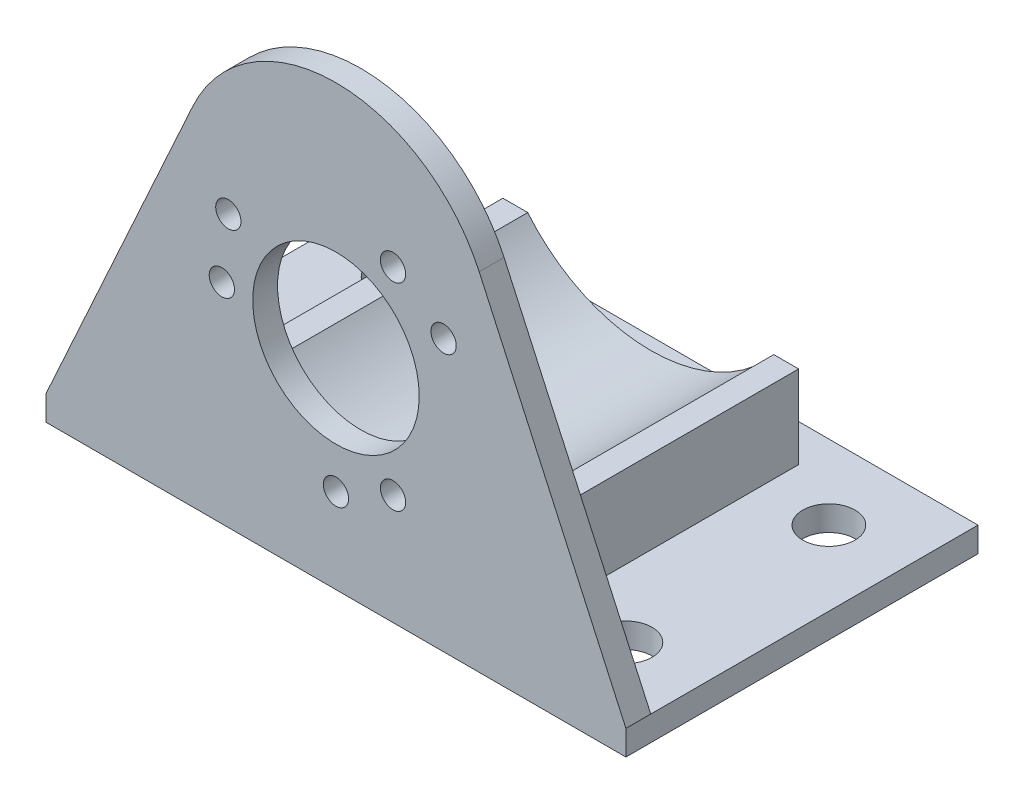
ISO-10303-21;
HEADER;
FILE_DESCRIPTION(('STEP AP214'),'2;1');
FILE_NAME('part.step','',(''),(''),'','','');
FILE_SCHEMA(('AUTOMOTIVE_DESIGN { 1 0 10303 214 1 1 1 1 }'));
ENDSEC;
DATA;
#1=APPLICATION_CONTEXT('core data for automotive mechanical design processes');
#2=APPLICATION_PROTOCOL_DEFINITION('international standard','automotive_design',2000,#1);
#3=PRODUCT_CONTEXT('',#1,'mechanical');
#4=PRODUCT('Part','Part','',(#3));
#5=PRODUCT_RELATED_PRODUCT_CATEGORY('part','',(#4));
#6=PRODUCT_DEFINITION_FORMATION('','',#4);
#7=PRODUCT_DEFINITION_CONTEXT('part definition',#1,'design');
#8=PRODUCT_DEFINITION('design','',#6,#7);
#9=PRODUCT_DEFINITION_SHAPE('','',#8);
#10=(LENGTH_UNIT() NAMED_UNIT(*) SI_UNIT(.MILLI.,.METRE.));
#11=(NAMED_UNIT(*) PLANE_ANGLE_UNIT() SI_UNIT($,.RADIAN.));
#12=(NAMED_UNIT(*) SI_UNIT($,.STERADIAN.) SOLID_ANGLE_UNIT());
#13=UNCERTAINTY_MEASURE_WITH_UNIT(LENGTH_MEASURE(1.E-05),#10,'distance_accuracy_value','');
#14=(GEOMETRIC_REPRESENTATION_CONTEXT(3) GLOBAL_UNCERTAINTY_ASSIGNED_CONTEXT((#13)) GLOBAL_UNIT_ASSIGNED_CONTEXT((#10,
#11,#12)) REPRESENTATION_CONTEXT('',''));
#15=CARTESIAN_POINT('',(0.,0.,0.));
#16=DIRECTION('',(0.,0.,1.));
#17=DIRECTION('',(1.,0.,0.));
#18=AXIS2_PLACEMENT_3D('',#15,#16,#17);
#19=CARTESIAN_POINT('',(0.,3.,0.));
#20=DIRECTION('',(0.,1.,0.));
#21=DIRECTION('',(0.,0.,1.));
#22=AXIS2_PLACEMENT_3D('',#19,#20,#21);
#23=PLANE('',#22);
#24=CARTESIAN_POINT('',(-26.,3.,12.25));
#25=DIRECTION('',(0.,1.,0.));
#26=DIRECTION('',(0.,0.,-1.));
#27=AXIS2_PLACEMENT_3D('',#24,#25,#26);
#28=CIRCLE('',#27,3.15);
#29=CARTESIAN_POINT('',(-26.,3.,9.1));
#30=VERTEX_POINT('',#29);
#31=EDGE_CURVE('E507',#30,#30,#28,.T.);
#32=ORIENTED_EDGE('',*,*,#31,.F.);
#33=EDGE_LOOP('',(#32));
#34=FACE_BOUND('',#33,.T.);
#35=CARTESIAN_POINT('',(26.,3.,12.25));
#36=DIRECTION('',(0.,1.,0.));
#37=DIRECTION('',(0.,0.,1.));
#38=AXIS2_PLACEMENT_3D('',#35,#36,#37);
#39=CIRCLE('',#38,3.15);
#40=CARTESIAN_POINT('',(26.,3.,15.4));
#41=VERTEX_POINT('',#40);
#42=EDGE_CURVE('E504',#41,#41,#39,.T.);
#43=ORIENTED_EDGE('',*,*,#42,.F.);
#44=EDGE_LOOP('',(#43));
#45=FACE_BOUND('',#44,.T.);
#46=CARTESIAN_POINT('',(26.,3.,-12.25));
#47=DIRECTION('',(0.,1.,0.));
#48=DIRECTION('',(0.,0.,-1.));
#49=AXIS2_PLACEMENT_3D('',#46,#47,#48);
#50=CIRCLE('',#49,3.15);
#51=CARTESIAN_POINT('',(26.,3.,-15.4));
#52=VERTEX_POINT('',#51);
#53=EDGE_CURVE('E500',#52,#52,#50,.T.);
#54=ORIENTED_EDGE('',*,*,#53,.F.);
#55=EDGE_LOOP('',(#54));
#56=FACE_BOUND('',#55,.T.);
#57=CARTESIAN_POINT('',(-26.,3.,-12.25));
#58=DIRECTION('',(0.,1.,0.));
#59=DIRECTION('',(0.,0.,1.));
#60=AXIS2_PLACEMENT_3D('',#57,#58,#59);
#61=CIRCLE('',#60,3.15);
#62=CARTESIAN_POINT('',(-26.,3.,-9.1));
#63=VERTEX_POINT('',#62);
#64=EDGE_CURVE('E349',#63,#63,#61,.T.);
#65=ORIENTED_EDGE('',*,*,#64,.F.);
#66=EDGE_LOOP('',(#65));
#67=FACE_BOUND('',#66,.T.);
#68=DIRECTION('',(0.,0.,1.));
#69=VECTOR('',#68,1.);
#70=CARTESIAN_POINT('',(17.8492424049175,3.,-16.75));
#71=LINE('',#70,#69);
#72=CARTESIAN_POINT('',(17.8492424049175,3.,-16.75));
#73=VERTEX_POINT('',#72);
#74=CARTESIAN_POINT('',(17.8492424049175,3.,18.25));
#75=VERTEX_POINT('',#74);
#76=EDGE_CURVE('E211',#73,#75,#71,.T.);
#77=ORIENTED_EDGE('',*,*,#76,.T.);
#78=DIRECTION('',(1.,0.,0.));
#79=VECTOR('',#78,1.);
#80=CARTESIAN_POINT('',(-35.,3.,18.25));
#81=LINE('',#80,#79);
#82=CARTESIAN_POINT('',(35.,3.,18.25));
#83=VERTEX_POINT('',#82);
#84=EDGE_CURVE('E74',#75,#83,#81,.T.);
#85=ORIENTED_EDGE('',*,*,#84,.T.);
#86=DIRECTION('',(0.,0.,-1.));
#87=VECTOR('',#86,1.);
#88=CARTESIAN_POINT('',(35.,3.,-21.25));
#89=LINE('',#88,#87);
#90=CARTESIAN_POINT('',(35.,3.,-21.25));
#91=VERTEX_POINT('',#90);
#92=EDGE_CURVE('E314',#83,#91,#89,.T.);
#93=ORIENTED_EDGE('',*,*,#92,.T.);
#94=DIRECTION('',(-1.,0.,0.));
#95=VECTOR('',#94,1.);
#96=CARTESIAN_POINT('',(-35.,3.,-21.25));
#97=LINE('',#96,#95);
#98=CARTESIAN_POINT('',(-35.,3.,-21.25));
#99=VERTEX_POINT('',#98);
#100=EDGE_CURVE('E313',#91,#99,#97,.T.);
#101=ORIENTED_EDGE('',*,*,#100,.T.);
#102=DIRECTION('',(0.,0.,1.));
#103=VECTOR('',#102,1.);
#104=CARTESIAN_POINT('',(-35.,3.,-21.25));
#105=LINE('',#104,#103);
#106=CARTESIAN_POINT('',(-35.,3.,18.25));
#107=VERTEX_POINT('',#106);
#108=EDGE_CURVE('E317',#99,#107,#105,.T.);
#109=ORIENTED_EDGE('',*,*,#108,.T.);
#110=CARTESIAN_POINT('',(-17.8492424049175,3.,18.25));
#111=VERTEX_POINT('',#110);
#112=EDGE_CURVE('E272',#107,#111,#81,.T.);
#113=ORIENTED_EDGE('',*,*,#112,.T.);
#114=DIRECTION('',(0.,0.,1.));
#115=VECTOR('',#114,1.);
#116=CARTESIAN_POINT('',(-17.8492424049175,3.,-16.75));
#117=LINE('',#116,#115);
#118=CARTESIAN_POINT('',(-17.8492424049175,3.,-16.75));
#119=VERTEX_POINT('',#118);
#120=EDGE_CURVE('E208',#119,#111,#117,.T.);
#121=ORIENTED_EDGE('',*,*,#120,.F.);
#122=DIRECTION('',(-1.,0.,0.));
#123=VECTOR('',#122,1.);
#124=CARTESIAN_POINT('',(0.,3.,-16.75));
#125=LINE('',#124,#123);
#126=EDGE_CURVE('E179',#73,#119,#125,.T.);
#127=ORIENTED_EDGE('',*,*,#126,.F.);
#128=EDGE_LOOP('',(#77,#85,#93,#101,#109,#113,#121,#127));
#129=FACE_BOUND('',#128,.T.);
#130=ADVANCED_FACE('F48',(#34,#45,#56,#67,#129),#23,.T.);
#131=CARTESIAN_POINT('',(35.,3.,-21.25));
#132=DIRECTION('',(-1.,0.,0.));
#133=DIRECTION('',(0.,0.,1.));
#134=AXIS2_PLACEMENT_3D('',#131,#132,#133);
#135=PLANE('',#134);
#136=DIRECTION('',(0.,0.,-1.));
#137=VECTOR('',#136,1.);
#138=CARTESIAN_POINT('',(35.,0.,-21.25));
#139=LINE('',#138,#137);
#140=CARTESIAN_POINT('',(35.,0.,21.25));
#141=VERTEX_POINT('',#140);
#142=CARTESIAN_POINT('',(35.,0.,-21.25));
#143=VERTEX_POINT('',#142);
#144=EDGE_CURVE('E303',#141,#143,#139,.T.);
#145=ORIENTED_EDGE('',*,*,#144,.T.);
#146=DIRECTION('',(0.,-1.,0.));
#147=VECTOR('',#146,1.);
#148=CARTESIAN_POINT('',(35.,3.,-21.25));
#149=LINE('',#148,#147);
#150=EDGE_CURVE('E11',#91,#143,#149,.T.);
#151=ORIENTED_EDGE('',*,*,#150,.F.);
#152=ORIENTED_EDGE('',*,*,#92,.F.);
#153=CARTESIAN_POINT('',(35.,3.,21.25));
#154=VERTEX_POINT('',#153);
#155=EDGE_CURVE('E309',#154,#83,#89,.T.);
#156=ORIENTED_EDGE('',*,*,#155,.F.);
#157=DIRECTION('',(0.,-1.,0.));
#158=VECTOR('',#157,1.);
#159=CARTESIAN_POINT('',(35.,3.,21.25));
#160=LINE('',#159,#158);
#161=EDGE_CURVE('E321',#154,#141,#160,.T.);
#162=ORIENTED_EDGE('',*,*,#161,.T.);
#163=EDGE_LOOP('',(#145,#151,#152,#156,#162));
#164=FACE_BOUND('',#163,.T.);
#165=ADVANCED_FACE('F50',(#164),#135,.F.);
#166=CARTESIAN_POINT('',(-35.,3.,-21.25));
#167=DIRECTION('',(0.,0.,1.));
#168=DIRECTION('',(1.,0.,0.));
#169=AXIS2_PLACEMENT_3D('',#166,#167,#168);
#170=PLANE('',#169);
#171=DIRECTION('',(-1.,0.,0.));
#172=VECTOR('',#171,1.);
#173=CARTESIAN_POINT('',(-35.,0.,-21.25));
#174=LINE('',#173,#172);
#175=CARTESIAN_POINT('',(-35.,0.,-21.25));
#176=VERTEX_POINT('',#175);
#177=EDGE_CURVE('E325',#143,#176,#174,.T.);
#178=ORIENTED_EDGE('',*,*,#177,.T.);
#179=DIRECTION('',(0.,-1.,0.));
#180=VECTOR('',#179,1.);
#181=CARTESIAN_POINT('',(-35.,3.,-21.25));
#182=LINE('',#181,#180);
#183=EDGE_CURVE('E58',#99,#176,#182,.T.);
#184=ORIENTED_EDGE('',*,*,#183,.F.);
#185=ORIENTED_EDGE('',*,*,#100,.F.);
#186=ORIENTED_EDGE('',*,*,#150,.T.);
#187=EDGE_LOOP('',(#178,#184,#185,#186));
#188=FACE_BOUND('',#187,.T.);
#189=ADVANCED_FACE('F384',(#188),#170,.F.);
#190=CARTESIAN_POINT('',(-35.,3.,-21.25));
#191=DIRECTION('',(1.,0.,0.));
#192=DIRECTION('',(0.,0.,-1.));
#193=AXIS2_PLACEMENT_3D('',#190,#191,#192);
#194=PLANE('',#193);
#195=DIRECTION('',(0.,0.,1.));
#196=VECTOR('',#195,1.);
#197=CARTESIAN_POINT('',(-35.,0.,-21.25));
#198=LINE('',#197,#196);
#199=CARTESIAN_POINT('',(-35.,0.,21.25));
#200=VERTEX_POINT('',#199);
#201=EDGE_CURVE('E328',#176,#200,#198,.T.);
#202=ORIENTED_EDGE('',*,*,#201,.T.);
#203=DIRECTION('',(0.,-1.,0.));
#204=VECTOR('',#203,1.);
#205=CARTESIAN_POINT('',(-35.,3.,21.25));
#206=LINE('',#205,#204);
#207=CARTESIAN_POINT('',(-35.,3.,21.25));
#208=VERTEX_POINT('',#207);
#209=EDGE_CURVE('E337',#208,#200,#206,.T.);
#210=ORIENTED_EDGE('',*,*,#209,.F.);
#211=DIRECTION('',(0.,0.,1.));
#212=VECTOR('',#211,1.);
#213=CARTESIAN_POINT('',(-35.,3.,18.25));
#214=LINE('',#213,#212);
#215=EDGE_CURVE('E300',#107,#208,#214,.T.);
#216=ORIENTED_EDGE('',*,*,#215,.F.);
#217=ORIENTED_EDGE('',*,*,#108,.F.);
#218=ORIENTED_EDGE('',*,*,#183,.T.);
#219=EDGE_LOOP('',(#202,#210,#216,#217,#218));
#220=FACE_BOUND('',#219,.T.);
#221=ADVANCED_FACE('F397',(#220),#194,.F.);
#222=CARTESIAN_POINT('',(-35.,3.,21.25));
#223=DIRECTION('',(0.,0.,-1.));
#224=DIRECTION('',(-1.,0.,0.));
#225=AXIS2_PLACEMENT_3D('',#222,#223,#224);
#226=PLANE('',#225);
#227=DIRECTION('',(1.,0.,0.));
#228=VECTOR('',#227,1.);
#229=CARTESIAN_POINT('',(-35.,0.,21.25));
#230=LINE('',#229,#228);
#231=EDGE_CURVE('E331',#200,#141,#230,.T.);
#232=ORIENTED_EDGE('',*,*,#231,.T.);
#233=ORIENTED_EDGE('',*,*,#161,.F.);
#234=DIRECTION('',(-0.414547417854789,0.910027712957099,0.));
#235=VECTOR('',#234,1.);
#236=CARTESIAN_POINT('',(17.2905265461849,41.876400939241,21.25));
#237=LINE('',#236,#235);
#238=CARTESIAN_POINT('',(17.2905265461849,41.876400939241,21.25));
#239=VERTEX_POINT('',#238);
#240=EDGE_CURVE('E268',#154,#239,#237,.T.);
#241=ORIENTED_EDGE('',*,*,#240,.T.);
#242=CARTESIAN_POINT('',(0.,34.,21.25));
#243=DIRECTION('',(0.,0.,1.));
#244=DIRECTION('',(1.,0.,0.));
#245=AXIS2_PLACEMENT_3D('',#242,#243,#244);
#246=CIRCLE('',#245,19.);
#247=CARTESIAN_POINT('',(-17.2905265461849,41.876400939241,21.25));
#248=VERTEX_POINT('',#247);
#249=EDGE_CURVE('E292',#239,#248,#246,.T.);
#250=ORIENTED_EDGE('',*,*,#249,.T.);
#251=DIRECTION('',(-0.414547417854789,-0.910027712957098,0.));
#252=VECTOR('',#251,1.);
#253=CARTESIAN_POINT('',(-35.,3.,21.25));
#254=LINE('',#253,#252);
#255=EDGE_CURVE('E296',#248,#208,#254,.T.);
#256=ORIENTED_EDGE('',*,*,#255,.T.);
#257=ORIENTED_EDGE('',*,*,#209,.T.);
#258=EDGE_LOOP('',(#232,#233,#241,#250,#256,#257));
#259=FACE_BOUND('',#258,.T.);
#260=CARTESIAN_POINT('',(0.,10.2500000000003,21.25));
#261=DIRECTION('',(0.,0.,1.));
#262=DIRECTION('',(1.,0.,0.));
#263=AXIS2_PLACEMENT_3D('',#260,#261,#262);
#264=CIRCLE('',#263,1.525);
#265=CARTESIAN_POINT('',(1.52500000000002,10.2500000000003,21.25));
#266=VERTEX_POINT('',#265);
#267=EDGE_CURVE('E159',#266,#266,#264,.T.);
#268=ORIENTED_EDGE('',*,*,#267,.F.);
#269=EDGE_LOOP('',(#268));
#270=FACE_BOUND('',#269,.T.);
#271=CARTESIAN_POINT('',(6.88737862723222,13.3207102866701,21.25));
#272=DIRECTION('',(0.,0.,1.));
#273=DIRECTION('',(1.,0.,0.));
#274=AXIS2_PLACEMENT_3D('',#271,#272,#273);
#275=CIRCLE('',#274,1.525);
#276=CARTESIAN_POINT('',(8.41237862723222,13.3207102866701,21.25));
#277=VERTEX_POINT('',#276);
#278=EDGE_CURVE('E220',#277,#277,#275,.T.);
#279=ORIENTED_EDGE('',*,*,#278,.F.);
#280=EDGE_LOOP('',(#279));
#281=FACE_BOUND('',#280,.T.);
#282=CARTESIAN_POINT('',(12.9903810567665,32.7500000000002,21.25));
#283=DIRECTION('',(0.,0.,1.));
#284=DIRECTION('',(1.,0.,0.));
#285=AXIS2_PLACEMENT_3D('',#282,#283,#284);
#286=CIRCLE('',#285,1.52499999999999);
#287=CARTESIAN_POINT('',(14.5153810567665,32.7500000000002,21.25));
#288=VERTEX_POINT('',#287);
#289=EDGE_CURVE('E228',#288,#288,#286,.T.);
#290=ORIENTED_EDGE('',*,*,#289,.F.);
#291=EDGE_LOOP('',(#290));
#292=FACE_BOUND('',#291,.T.);
#293=CARTESIAN_POINT('',(6.88737862723206,37.1792897133303,21.25));
#294=DIRECTION('',(0.,0.,1.));
#295=DIRECTION('',(1.,0.,0.));
#296=AXIS2_PLACEMENT_3D('',#293,#294,#295);
#297=CIRCLE('',#296,1.525);
#298=CARTESIAN_POINT('',(8.41237862723206,37.1792897133303,21.25));
#299=VERTEX_POINT('',#298);
#300=EDGE_CURVE('E236',#299,#299,#297,.T.);
#301=ORIENTED_EDGE('',*,*,#300,.F.);
#302=EDGE_LOOP('',(#301));
#303=FACE_BOUND('',#302,.T.);
#304=CARTESIAN_POINT('',(-12.9903810567666,32.75,21.25));
#305=DIRECTION('',(0.,0.,1.));
#306=DIRECTION('',(1.,0.,0.));
#307=AXIS2_PLACEMENT_3D('',#304,#305,#306);
#308=CIRCLE('',#307,1.525);
#309=CARTESIAN_POINT('',(-11.4653810567666,32.75,21.25));
#310=VERTEX_POINT('',#309);
#311=EDGE_CURVE('E244',#310,#310,#308,.T.);
#312=ORIENTED_EDGE('',*,*,#311,.F.);
#313=EDGE_LOOP('',(#312));
#314=FACE_BOUND('',#313,.T.);
#315=CARTESIAN_POINT('',(-13.7747572544643,25.25,21.25));
#316=DIRECTION('',(0.,0.,1.));
#317=DIRECTION('',(1.,0.,0.));
#318=AXIS2_PLACEMENT_3D('',#315,#316,#317);
#319=CIRCLE('',#318,1.525);
#320=CARTESIAN_POINT('',(-12.2497572544643,25.25,21.25));
#321=VERTEX_POINT('',#320);
#322=EDGE_CURVE('E252',#321,#321,#319,.T.);
#323=ORIENTED_EDGE('',*,*,#322,.F.);
#324=EDGE_LOOP('',(#323));
#325=FACE_BOUND('',#324,.T.);
#326=CARTESIAN_POINT('',(0.,25.25,21.25));
#327=DIRECTION('',(0.,0.,1.));
#328=DIRECTION('',(1.,0.,0.));
#329=AXIS2_PLACEMENT_3D('',#326,#327,#328);
#330=CIRCLE('',#329,10.05);
#331=CARTESIAN_POINT('',(10.05,25.25,21.25));
#332=VERTEX_POINT('',#331);
#333=EDGE_CURVE('E260',#332,#332,#330,.T.);
#334=ORIENTED_EDGE('',*,*,#333,.F.);
#335=EDGE_LOOP('',(#334));
#336=FACE_BOUND('',#335,.T.);
#337=ADVANCED_FACE('F394',(#259,#270,#281,#292,#303,#314,#325,#336),#226,.F.);
#338=CARTESIAN_POINT('',(0.,0.,0.));
#339=DIRECTION('',(0.,1.,0.));
#340=DIRECTION('',(0.,0.,1.));
#341=AXIS2_PLACEMENT_3D('',#338,#339,#340);
#342=PLANE('',#341);
#343=CARTESIAN_POINT('',(-26.,0.,12.25));
#344=DIRECTION('',(0.,1.,0.));
#345=DIRECTION('',(0.,0.,1.));
#346=AXIS2_PLACEMENT_3D('',#343,#344,#345);
#347=CIRCLE('',#346,3.15);
#348=CARTESIAN_POINT('',(-26.,0.,15.4));
#349=VERTEX_POINT('',#348);
#350=EDGE_CURVE('E52',#349,#349,#347,.T.);
#351=ORIENTED_EDGE('',*,*,#350,.T.);
#352=EDGE_LOOP('',(#351));
#353=FACE_BOUND('',#352,.T.);
#354=CARTESIAN_POINT('',(26.,0.,12.25));
#355=DIRECTION('',(0.,1.,0.));
#356=DIRECTION('',(0.,0.,1.));
#357=AXIS2_PLACEMENT_3D('',#354,#355,#356);
#358=CIRCLE('',#357,3.15);
#359=CARTESIAN_POINT('',(26.,0.,15.4));
#360=VERTEX_POINT('',#359);
#361=EDGE_CURVE('E352',#360,#360,#358,.T.);
#362=ORIENTED_EDGE('',*,*,#361,.T.);
#363=EDGE_LOOP('',(#362));
#364=FACE_BOUND('',#363,.T.);
#365=CARTESIAN_POINT('',(26.,0.,-12.25));
#366=DIRECTION('',(0.,1.,0.));
#367=DIRECTION('',(0.,0.,1.));
#368=AXIS2_PLACEMENT_3D('',#365,#366,#367);
#369=CIRCLE('',#368,3.15);
#370=CARTESIAN_POINT('',(26.,0.,-9.10000000000001));
#371=VERTEX_POINT('',#370);
#372=EDGE_CURVE('E348',#371,#371,#369,.T.);
#373=ORIENTED_EDGE('',*,*,#372,.T.);
#374=EDGE_LOOP('',(#373));
#375=FACE_BOUND('',#374,.T.);
#376=CARTESIAN_POINT('',(-26.,0.,-12.25));
#377=DIRECTION('',(0.,1.,0.));
#378=DIRECTION('',(0.,0.,1.));
#379=AXIS2_PLACEMENT_3D('',#376,#377,#378);
#380=CIRCLE('',#379,3.15);
#381=CARTESIAN_POINT('',(-26.,0.,-9.1));
#382=VERTEX_POINT('',#381);
#383=EDGE_CURVE('E344',#382,#382,#380,.T.);
#384=ORIENTED_EDGE('',*,*,#383,.T.);
#385=EDGE_LOOP('',(#384));
#386=FACE_BOUND('',#385,.T.);
#387=ORIENTED_EDGE('',*,*,#144,.F.);
#388=ORIENTED_EDGE('',*,*,#231,.F.);
#389=ORIENTED_EDGE('',*,*,#201,.F.);
#390=ORIENTED_EDGE('',*,*,#177,.F.);
#391=EDGE_LOOP('',(#387,#388,#389,#390));
#392=FACE_BOUND('',#391,.T.);
#393=ADVANCED_FACE('F361',(#353,#364,#375,#386,#392),#342,.F.);
#394=CARTESIAN_POINT('',(-35.,3.,18.25));
#395=DIRECTION('',(-0.910027712957098,0.414547417854789,0.));
#396=DIRECTION('',(-0.414547417854789,-0.910027712957099,0.));
#397=AXIS2_PLACEMENT_3D('',#394,#395,#396);
#398=PLANE('',#397);
#399=ORIENTED_EDGE('',*,*,#255,.F.);
#400=DIRECTION('',(0.,0.,1.));
#401=VECTOR('',#400,1.);
#402=CARTESIAN_POINT('',(-17.2905265461849,41.876400939241,18.25));
#403=LINE('',#402,#401);
#404=CARTESIAN_POINT('',(-17.2905265461849,41.876400939241,18.25));
#405=VERTEX_POINT('',#404);
#406=EDGE_CURVE('E304',#405,#248,#403,.T.);
#407=ORIENTED_EDGE('',*,*,#406,.F.);
#408=DIRECTION('',(-0.414547417854789,-0.910027712957098,0.));
#409=VECTOR('',#408,1.);
#410=CARTESIAN_POINT('',(-35.,3.,18.25));
#411=LINE('',#410,#409);
#412=EDGE_CURVE('E284',#405,#107,#411,.T.);
#413=ORIENTED_EDGE('',*,*,#412,.T.);
#414=ORIENTED_EDGE('',*,*,#215,.T.);
#415=EDGE_LOOP('',(#399,#407,#413,#414));
#416=FACE_BOUND('',#415,.T.);
#417=ADVANCED_FACE('F393',(#416),#398,.T.);
#418=CARTESIAN_POINT('',(0.,34.,18.25));
#419=DIRECTION('',(0.,0.,1.));
#420=DIRECTION('',(1.,0.,0.));
#421=AXIS2_PLACEMENT_3D('',#418,#419,#420);
#422=CYLINDRICAL_SURFACE('',#421,19.);
#423=ORIENTED_EDGE('',*,*,#249,.F.);
#424=DIRECTION('',(0.,0.,1.));
#425=VECTOR('',#424,1.);
#426=CARTESIAN_POINT('',(17.2905265461849,41.876400939241,18.25));
#427=LINE('',#426,#425);
#428=CARTESIAN_POINT('',(17.2905265461849,41.876400939241,18.25));
#429=VERTEX_POINT('',#428);
#430=EDGE_CURVE('E288',#429,#239,#427,.T.);
#431=ORIENTED_EDGE('',*,*,#430,.F.);
#432=CARTESIAN_POINT('',(0.,34.,18.25));
#433=DIRECTION('',(0.,0.,1.));
#434=DIRECTION('',(1.,0.,0.));
#435=AXIS2_PLACEMENT_3D('',#432,#433,#434);
#436=CIRCLE('',#435,19.);
#437=EDGE_CURVE('E280',#429,#405,#436,.T.);
#438=ORIENTED_EDGE('',*,*,#437,.T.);
#439=ORIENTED_EDGE('',*,*,#406,.T.);
#440=EDGE_LOOP('',(#423,#431,#438,#439));
#441=FACE_BOUND('',#440,.T.);
#442=ADVANCED_FACE('F438',(#441),#422,.T.);
#443=CARTESIAN_POINT('',(17.2905265461849,41.876400939241,18.25));
#444=DIRECTION('',(0.910027712957098,0.414547417854789,0.));
#445=DIRECTION('',(-0.414547417854789,0.910027712957099,0.));
#446=AXIS2_PLACEMENT_3D('',#443,#444,#445);
#447=PLANE('',#446);
#448=ORIENTED_EDGE('',*,*,#240,.F.);
#449=ORIENTED_EDGE('',*,*,#155,.T.);
#450=DIRECTION('',(-0.414547417854789,0.910027712957099,0.));
#451=VECTOR('',#450,1.);
#452=CARTESIAN_POINT('',(17.2905265461849,41.876400939241,18.25));
#453=LINE('',#452,#451);
#454=EDGE_CURVE('E276',#83,#429,#453,.T.);
#455=ORIENTED_EDGE('',*,*,#454,.T.);
#456=ORIENTED_EDGE('',*,*,#430,.T.);
#457=EDGE_LOOP('',(#448,#449,#455,#456));
#458=FACE_BOUND('',#457,.T.);
#459=ADVANCED_FACE('F390',(#458),#447,.T.);
#460=CARTESIAN_POINT('',(0.,34.,18.25));
#461=DIRECTION('',(0.,0.,1.));
#462=DIRECTION('',(1.,0.,0.));
#463=AXIS2_PLACEMENT_3D('',#460,#461,#462);
#464=PLANE('',#463);
#465=ORIENTED_EDGE('',*,*,#84,.F.);
#466=DIRECTION('',(0.,1.,0.));
#467=VECTOR('',#466,1.);
#468=CARTESIAN_POINT('',(17.8492424049175,0.,18.25));
#469=LINE('',#468,#467);
#470=CARTESIAN_POINT('',(17.8492424049175,13.,18.25));
#471=VERTEX_POINT('',#470);
#472=EDGE_CURVE('E200',#75,#471,#469,.T.);
#473=ORIENTED_EDGE('',*,*,#472,.T.);
#474=DIRECTION('',(-1.,0.,0.));
#475=VECTOR('',#474,1.);
#476=CARTESIAN_POINT('',(0.,13.,18.25));
#477=LINE('',#476,#475);
#478=CARTESIAN_POINT('',(14.8492424049175,13.,18.25));
#479=VERTEX_POINT('',#478);
#480=EDGE_CURVE('E197',#471,#479,#477,.T.);
#481=ORIENTED_EDGE('',*,*,#480,.T.);
#482=CARTESIAN_POINT('',(0.,25.25,18.25));
#483=DIRECTION('',(0.,0.,-1.));
#484=DIRECTION('',(-1.,0.,0.));
#485=AXIS2_PLACEMENT_3D('',#482,#483,#484);
#486=CIRCLE('',#485,19.25);
#487=CARTESIAN_POINT('',(-14.8492424049175,13.,18.25));
#488=VERTEX_POINT('',#487);
#489=EDGE_CURVE('E153',#479,#488,#486,.T.);
#490=ORIENTED_EDGE('',*,*,#489,.T.);
#491=CARTESIAN_POINT('',(-17.8492424049175,13.,18.25));
#492=VERTEX_POINT('',#491);
#493=EDGE_CURVE('E172',#488,#492,#477,.T.);
#494=ORIENTED_EDGE('',*,*,#493,.T.);
#495=DIRECTION('',(0.,-1.,0.));
#496=VECTOR('',#495,1.);
#497=CARTESIAN_POINT('',(-17.8492424049175,0.,18.25));
#498=LINE('',#497,#496);
#499=EDGE_CURVE('E66',#492,#111,#498,.T.);
#500=ORIENTED_EDGE('',*,*,#499,.T.);
#501=ORIENTED_EDGE('',*,*,#112,.F.);
#502=ORIENTED_EDGE('',*,*,#412,.F.);
#503=ORIENTED_EDGE('',*,*,#437,.F.);
#504=ORIENTED_EDGE('',*,*,#454,.F.);
#505=EDGE_LOOP('',(#465,#473,#481,#490,#494,#500,#501,#502,#503,#504));
#506=FACE_BOUND('',#505,.T.);
#507=CARTESIAN_POINT('',(0.,10.2500000000003,18.25));
#508=DIRECTION('',(0.,0.,1.));
#509=DIRECTION('',(1.,0.,0.));
#510=AXIS2_PLACEMENT_3D('',#507,#508,#509);
#511=CIRCLE('',#510,1.525);
#512=CARTESIAN_POINT('',(1.52500000000002,10.2500000000003,18.25));
#513=VERTEX_POINT('',#512);
#514=EDGE_CURVE('E216',#513,#513,#511,.T.);
#515=ORIENTED_EDGE('',*,*,#514,.T.);
#516=EDGE_LOOP('',(#515));
#517=FACE_BOUND('',#516,.T.);
#518=CARTESIAN_POINT('',(6.88737862723222,13.3207102866701,18.25));
#519=DIRECTION('',(0.,0.,1.));
#520=DIRECTION('',(1.,0.,0.));
#521=AXIS2_PLACEMENT_3D('',#518,#519,#520);
#522=CIRCLE('',#521,1.525);
#523=CARTESIAN_POINT('',(8.41237862723222,13.3207102866701,18.25));
#524=VERTEX_POINT('',#523);
#525=EDGE_CURVE('E224',#524,#524,#522,.T.);
#526=ORIENTED_EDGE('',*,*,#525,.T.);
#527=EDGE_LOOP('',(#526));
#528=FACE_BOUND('',#527,.T.);
#529=CARTESIAN_POINT('',(12.9903810567665,32.7500000000002,18.25));
#530=DIRECTION('',(0.,0.,1.));
#531=DIRECTION('',(1.,0.,0.));
#532=AXIS2_PLACEMENT_3D('',#529,#530,#531);
#533=CIRCLE('',#532,1.52499999999999);
#534=CARTESIAN_POINT('',(14.5153810567665,32.7500000000002,18.25));
#535=VERTEX_POINT('',#534);
#536=EDGE_CURVE('E232',#535,#535,#533,.T.);
#537=ORIENTED_EDGE('',*,*,#536,.T.);
#538=EDGE_LOOP('',(#537));
#539=FACE_BOUND('',#538,.T.);
#540=CARTESIAN_POINT('',(6.88737862723206,37.1792897133303,18.25));
#541=DIRECTION('',(0.,0.,1.));
#542=DIRECTION('',(1.,0.,0.));
#543=AXIS2_PLACEMENT_3D('',#540,#541,#542);
#544=CIRCLE('',#543,1.525);
#545=CARTESIAN_POINT('',(8.41237862723206,37.1792897133303,18.25));
#546=VERTEX_POINT('',#545);
#547=EDGE_CURVE('E240',#546,#546,#544,.T.);
#548=ORIENTED_EDGE('',*,*,#547,.T.);
#549=EDGE_LOOP('',(#548));
#550=FACE_BOUND('',#549,.T.);
#551=CARTESIAN_POINT('',(-12.9903810567666,32.75,18.25));
#552=DIRECTION('',(0.,0.,1.));
#553=DIRECTION('',(1.,0.,0.));
#554=AXIS2_PLACEMENT_3D('',#551,#552,#553);
#555=CIRCLE('',#554,1.525);
#556=CARTESIAN_POINT('',(-11.4653810567666,32.75,18.25));
#557=VERTEX_POINT('',#556);
#558=EDGE_CURVE('E248',#557,#557,#555,.T.);
#559=ORIENTED_EDGE('',*,*,#558,.T.);
#560=EDGE_LOOP('',(#559));
#561=FACE_BOUND('',#560,.T.);
#562=CARTESIAN_POINT('',(-13.7747572544643,25.25,18.25));
#563=DIRECTION('',(0.,0.,1.));
#564=DIRECTION('',(1.,0.,0.));
#565=AXIS2_PLACEMENT_3D('',#562,#563,#564);
#566=CIRCLE('',#565,1.525);
#567=CARTESIAN_POINT('',(-12.2497572544643,25.25,18.25));
#568=VERTEX_POINT('',#567);
#569=EDGE_CURVE('E256',#568,#568,#566,.T.);
#570=ORIENTED_EDGE('',*,*,#569,.T.);
#571=EDGE_LOOP('',(#570));
#572=FACE_BOUND('',#571,.T.);
#573=CARTESIAN_POINT('',(0.,25.25,18.25));
#574=DIRECTION('',(0.,0.,1.));
#575=DIRECTION('',(1.,0.,0.));
#576=AXIS2_PLACEMENT_3D('',#573,#574,#575);
#577=CIRCLE('',#576,10.05);
#578=CARTESIAN_POINT('',(10.05,25.25,18.25));
#579=VERTEX_POINT('',#578);
#580=EDGE_CURVE('E264',#579,#579,#577,.T.);
#581=ORIENTED_EDGE('',*,*,#580,.T.);
#582=EDGE_LOOP('',(#581));
#583=FACE_BOUND('',#582,.T.);
#584=ADVANCED_FACE('F429',(#506,#517,#528,#539,#550,#561,#572,#583),#464,.F.);
#585=CARTESIAN_POINT('',(0.,25.25,18.25));
#586=DIRECTION('',(0.,0.,1.));
#587=DIRECTION('',(1.,0.,0.));
#588=AXIS2_PLACEMENT_3D('',#585,#586,#587);
#589=CYLINDRICAL_SURFACE('',#588,10.05);
#590=ORIENTED_EDGE('',*,*,#580,.F.);
#591=EDGE_LOOP('',(#590));
#592=FACE_BOUND('',#591,.T.);
#593=ORIENTED_EDGE('',*,*,#333,.T.);
#594=EDGE_LOOP('',(#593));
#595=FACE_BOUND('',#594,.T.);
#596=ADVANCED_FACE('F448',(#592,#595),#589,.F.);
#597=CARTESIAN_POINT('',(-13.7747572544643,25.25,18.25));
#598=DIRECTION('',(0.,0.,1.));
#599=DIRECTION('',(1.,0.,0.));
#600=AXIS2_PLACEMENT_3D('',#597,#598,#599);
#601=CYLINDRICAL_SURFACE('',#600,1.525);
#602=ORIENTED_EDGE('',*,*,#569,.F.);
#603=EDGE_LOOP('',(#602));
#604=FACE_BOUND('',#603,.T.);
#605=ORIENTED_EDGE('',*,*,#322,.T.);
#606=EDGE_LOOP('',(#605));
#607=FACE_BOUND('',#606,.T.);
#608=ADVANCED_FACE('F451',(#604,#607),#601,.F.);
#609=CARTESIAN_POINT('',(-12.9903810567666,32.75,18.25));
#610=DIRECTION('',(0.,0.,1.));
#611=DIRECTION('',(1.,0.,0.));
#612=AXIS2_PLACEMENT_3D('',#609,#610,#611);
#613=CYLINDRICAL_SURFACE('',#612,1.525);
#614=ORIENTED_EDGE('',*,*,#558,.F.);
#615=EDGE_LOOP('',(#614));
#616=FACE_BOUND('',#615,.T.);
#617=ORIENTED_EDGE('',*,*,#311,.T.);
#618=EDGE_LOOP('',(#617));
#619=FACE_BOUND('',#618,.T.);
#620=ADVANCED_FACE('F455',(#616,#619),#613,.F.);
#621=CARTESIAN_POINT('',(6.88737862723206,37.1792897133303,18.25));
#622=DIRECTION('',(0.,0.,1.));
#623=DIRECTION('',(1.,0.,0.));
#624=AXIS2_PLACEMENT_3D('',#621,#622,#623);
#625=CYLINDRICAL_SURFACE('',#624,1.525);
#626=ORIENTED_EDGE('',*,*,#547,.F.);
#627=EDGE_LOOP('',(#626));
#628=FACE_BOUND('',#627,.T.);
#629=ORIENTED_EDGE('',*,*,#300,.T.);
#630=EDGE_LOOP('',(#629));
#631=FACE_BOUND('',#630,.T.);
#632=ADVANCED_FACE('F459',(#628,#631),#625,.F.);
#633=CARTESIAN_POINT('',(12.9903810567665,32.7500000000002,18.25));
#634=DIRECTION('',(0.,0.,1.));
#635=DIRECTION('',(1.,0.,0.));
#636=AXIS2_PLACEMENT_3D('',#633,#634,#635);
#637=CYLINDRICAL_SURFACE('',#636,1.52499999999999);
#638=ORIENTED_EDGE('',*,*,#536,.F.);
#639=EDGE_LOOP('',(#638));
#640=FACE_BOUND('',#639,.T.);
#641=ORIENTED_EDGE('',*,*,#289,.T.);
#642=EDGE_LOOP('',(#641));
#643=FACE_BOUND('',#642,.T.);
#644=ADVANCED_FACE('F463',(#640,#643),#637,.F.);
#645=CARTESIAN_POINT('',(6.88737862723222,13.3207102866701,18.25));
#646=DIRECTION('',(0.,0.,1.));
#647=DIRECTION('',(1.,0.,0.));
#648=AXIS2_PLACEMENT_3D('',#645,#646,#647);
#649=CYLINDRICAL_SURFACE('',#648,1.525);
#650=ORIENTED_EDGE('',*,*,#525,.F.);
#651=EDGE_LOOP('',(#650));
#652=FACE_BOUND('',#651,.T.);
#653=ORIENTED_EDGE('',*,*,#278,.T.);
#654=EDGE_LOOP('',(#653));
#655=FACE_BOUND('',#654,.T.);
#656=ADVANCED_FACE('F467',(#652,#655),#649,.F.);
#657=CARTESIAN_POINT('',(0.,10.2500000000003,18.25));
#658=DIRECTION('',(0.,0.,1.));
#659=DIRECTION('',(1.,0.,0.));
#660=AXIS2_PLACEMENT_3D('',#657,#658,#659);
#661=CYLINDRICAL_SURFACE('',#660,1.525);
#662=ORIENTED_EDGE('',*,*,#514,.F.);
#663=EDGE_LOOP('',(#662));
#664=FACE_BOUND('',#663,.T.);
#665=ORIENTED_EDGE('',*,*,#267,.T.);
#666=EDGE_LOOP('',(#665));
#667=FACE_BOUND('',#666,.T.);
#668=ADVANCED_FACE('F471',(#664,#667),#661,.F.);
#669=CARTESIAN_POINT('',(0.,25.25,-16.75));
#670=DIRECTION('',(0.,0.,1.));
#671=DIRECTION('',(1.,0.,0.));
#672=AXIS2_PLACEMENT_3D('',#669,#670,#671);
#673=CYLINDRICAL_SURFACE('',#672,19.25);
#674=ORIENTED_EDGE('',*,*,#489,.F.);
#675=DIRECTION('',(0.,0.,1.));
#676=VECTOR('',#675,1.);
#677=CARTESIAN_POINT('',(14.8492424049175,13.,-16.75));
#678=LINE('',#677,#676);
#679=CARTESIAN_POINT('',(14.8492424049175,13.,-16.75));
#680=VERTEX_POINT('',#679);
#681=EDGE_CURVE('E147',#680,#479,#678,.T.);
#682=ORIENTED_EDGE('',*,*,#681,.F.);
#683=CARTESIAN_POINT('',(0.,25.25,-16.75));
#684=DIRECTION('',(0.,0.,-1.));
#685=DIRECTION('',(-1.,0.,0.));
#686=AXIS2_PLACEMENT_3D('',#683,#684,#685);
#687=CIRCLE('',#686,19.25);
#688=CARTESIAN_POINT('',(-14.8492424049175,13.,-16.75));
#689=VERTEX_POINT('',#688);
#690=EDGE_CURVE('E150',#680,#689,#687,.T.);
#691=ORIENTED_EDGE('',*,*,#690,.T.);
#692=DIRECTION('',(0.,0.,1.));
#693=VECTOR('',#692,1.);
#694=CARTESIAN_POINT('',(-14.8492424049175,13.,-16.75));
#695=LINE('',#694,#693);
#696=EDGE_CURVE('E182',#689,#488,#695,.T.);
#697=ORIENTED_EDGE('',*,*,#696,.T.);
#698=EDGE_LOOP('',(#674,#682,#691,#697));
#699=FACE_BOUND('',#698,.T.);
#700=ADVANCED_FACE('F149',(#699),#673,.F.);
#701=CARTESIAN_POINT('',(0.,13.,-16.75));
#702=DIRECTION('',(0.,1.,0.));
#703=DIRECTION('',(-1.,0.,0.));
#704=AXIS2_PLACEMENT_3D('',#701,#702,#703);
#705=PLANE('',#704);
#706=ORIENTED_EDGE('',*,*,#480,.F.);
#707=DIRECTION('',(0.,0.,1.));
#708=VECTOR('',#707,1.);
#709=CARTESIAN_POINT('',(17.8492424049175,13.,-16.75));
#710=LINE('',#709,#708);
#711=CARTESIAN_POINT('',(17.8492424049175,13.,-16.75));
#712=VERTEX_POINT('',#711);
#713=EDGE_CURVE('E160',#712,#471,#710,.T.);
#714=ORIENTED_EDGE('',*,*,#713,.F.);
#715=DIRECTION('',(-1.,0.,0.));
#716=VECTOR('',#715,1.);
#717=CARTESIAN_POINT('',(0.,13.,-16.75));
#718=LINE('',#717,#716);
#719=EDGE_CURVE('E166',#712,#680,#718,.T.);
#720=ORIENTED_EDGE('',*,*,#719,.T.);
#721=ORIENTED_EDGE('',*,*,#681,.T.);
#722=EDGE_LOOP('',(#706,#714,#720,#721));
#723=FACE_BOUND('',#722,.T.);
#724=ADVANCED_FACE('F174',(#723),#705,.T.);
#725=CARTESIAN_POINT('',(17.8492424049175,0.,-16.75));
#726=DIRECTION('',(1.,0.,0.));
#727=DIRECTION('',(0.,1.,0.));
#728=AXIS2_PLACEMENT_3D('',#725,#726,#727);
#729=PLANE('',#728);
#730=ORIENTED_EDGE('',*,*,#472,.F.);
#731=ORIENTED_EDGE('',*,*,#76,.F.);
#732=DIRECTION('',(0.,1.,0.));
#733=VECTOR('',#732,1.);
#734=CARTESIAN_POINT('',(17.8492424049175,0.,-16.75));
#735=LINE('',#734,#733);
#736=EDGE_CURVE('E176',#73,#712,#735,.T.);
#737=ORIENTED_EDGE('',*,*,#736,.T.);
#738=ORIENTED_EDGE('',*,*,#713,.T.);
#739=EDGE_LOOP('',(#730,#731,#737,#738));
#740=FACE_BOUND('',#739,.T.);
#741=ADVANCED_FACE('F478',(#740),#729,.T.);
#742=CARTESIAN_POINT('',(-17.8492424049175,0.,-16.75));
#743=DIRECTION('',(-1.,0.,0.));
#744=DIRECTION('',(0.,-1.,0.));
#745=AXIS2_PLACEMENT_3D('',#742,#743,#744);
#746=PLANE('',#745);
#747=ORIENTED_EDGE('',*,*,#499,.F.);
#748=DIRECTION('',(0.,0.,1.));
#749=VECTOR('',#748,1.);
#750=CARTESIAN_POINT('',(-17.8492424049175,13.,-16.75));
#751=LINE('',#750,#749);
#752=CARTESIAN_POINT('',(-17.8492424049175,13.,-16.75));
#753=VERTEX_POINT('',#752);
#754=EDGE_CURVE('E187',#753,#492,#751,.T.);
#755=ORIENTED_EDGE('',*,*,#754,.F.);
#756=DIRECTION('',(0.,-1.,0.));
#757=VECTOR('',#756,1.);
#758=CARTESIAN_POINT('',(-17.8492424049175,0.,-16.75));
#759=LINE('',#758,#757);
#760=EDGE_CURVE('E183',#753,#119,#759,.T.);
#761=ORIENTED_EDGE('',*,*,#760,.T.);
#762=ORIENTED_EDGE('',*,*,#120,.T.);
#763=EDGE_LOOP('',(#747,#755,#761,#762));
#764=FACE_BOUND('',#763,.T.);
#765=ADVANCED_FACE('F436',(#764),#746,.T.);
#766=ORIENTED_EDGE('',*,*,#493,.F.);
#767=ORIENTED_EDGE('',*,*,#696,.F.);
#768=EDGE_CURVE('E170',#689,#753,#718,.T.);
#769=ORIENTED_EDGE('',*,*,#768,.T.);
#770=ORIENTED_EDGE('',*,*,#754,.T.);
#771=EDGE_LOOP('',(#766,#767,#769,#770));
#772=FACE_BOUND('',#771,.T.);
#773=ADVANCED_FACE('F435',(#772),#705,.T.);
#774=CARTESIAN_POINT('',(0.,0.,-16.75));
#775=DIRECTION('',(0.,0.,-1.));
#776=DIRECTION('',(-1.,0.,0.));
#777=AXIS2_PLACEMENT_3D('',#774,#775,#776);
#778=PLANE('',#777);
#779=ORIENTED_EDGE('',*,*,#690,.F.);
#780=ORIENTED_EDGE('',*,*,#719,.F.);
#781=ORIENTED_EDGE('',*,*,#736,.F.);
#782=ORIENTED_EDGE('',*,*,#126,.T.);
#783=ORIENTED_EDGE('',*,*,#760,.F.);
#784=ORIENTED_EDGE('',*,*,#768,.F.);
#785=EDGE_LOOP('',(#779,#780,#781,#782,#783,#784));
#786=FACE_BOUND('',#785,.T.);
#787=ADVANCED_FACE('F164',(#786),#778,.T.);
#788=CARTESIAN_POINT('',(-26.,-2.,-12.25));
#789=DIRECTION('',(0.,1.,0.));
#790=DIRECTION('',(0.,0.,1.));
#791=AXIS2_PLACEMENT_3D('',#788,#789,#790);
#792=CYLINDRICAL_SURFACE('',#791,3.15);
#793=ORIENTED_EDGE('',*,*,#64,.T.);
#794=EDGE_LOOP('',(#793));
#795=FACE_BOUND('',#794,.T.);
#796=ORIENTED_EDGE('',*,*,#383,.F.);
#797=EDGE_LOOP('',(#796));
#798=FACE_BOUND('',#797,.T.);
#799=ADVANCED_FACE('F485',(#795,#798),#792,.F.);
#800=CARTESIAN_POINT('',(26.,-2.,-12.25));
#801=DIRECTION('',(0.,1.,0.));
#802=DIRECTION('',(0.,0.,1.));
#803=AXIS2_PLACEMENT_3D('',#800,#801,#802);
#804=CYLINDRICAL_SURFACE('',#803,3.15);
#805=ORIENTED_EDGE('',*,*,#53,.T.);
#806=EDGE_LOOP('',(#805));
#807=FACE_BOUND('',#806,.T.);
#808=ORIENTED_EDGE('',*,*,#372,.F.);
#809=EDGE_LOOP('',(#808));
#810=FACE_BOUND('',#809,.T.);
#811=ADVANCED_FACE('F371',(#807,#810),#804,.F.);
#812=CARTESIAN_POINT('',(26.,-2.,12.25));
#813=DIRECTION('',(0.,1.,0.));
#814=DIRECTION('',(0.,0.,1.));
#815=AXIS2_PLACEMENT_3D('',#812,#813,#814);
#816=CYLINDRICAL_SURFACE('',#815,3.15);
#817=ORIENTED_EDGE('',*,*,#42,.T.);
#818=EDGE_LOOP('',(#817));
#819=FACE_BOUND('',#818,.T.);
#820=ORIENTED_EDGE('',*,*,#361,.F.);
#821=EDGE_LOOP('',(#820));
#822=FACE_BOUND('',#821,.T.);
#823=ADVANCED_FACE('F365',(#819,#822),#816,.F.);
#824=CARTESIAN_POINT('',(-26.,-2.,12.25));
#825=DIRECTION('',(0.,1.,0.));
#826=DIRECTION('',(0.,0.,1.));
#827=AXIS2_PLACEMENT_3D('',#824,#825,#826);
#828=CYLINDRICAL_SURFACE('',#827,3.15);
#829=ORIENTED_EDGE('',*,*,#31,.T.);
#830=EDGE_LOOP('',(#829));
#831=FACE_BOUND('',#830,.T.);
#832=ORIENTED_EDGE('',*,*,#350,.F.);
#833=EDGE_LOOP('',(#832));
#834=FACE_BOUND('',#833,.T.);
#835=ADVANCED_FACE('F363',(#831,#834),#828,.F.);
#836=CLOSED_SHELL('',(#130,#165,#189,#221,#337,#393,#417,#442,#459,#584,#596,#608,#620,#632,
#644,#656,#668,#700,#724,#741,#765,#773,#787,#799,#811,#823,#835));
#837=MANIFOLD_SOLID_BREP('B2',#836);
#838=ADVANCED_BREP_SHAPE_REPRESENTATION('',(#18,#837),#14);
#839=SHAPE_DEFINITION_REPRESENTATION(#9,#838);
ENDSEC;
END-ISO-10303-21;
